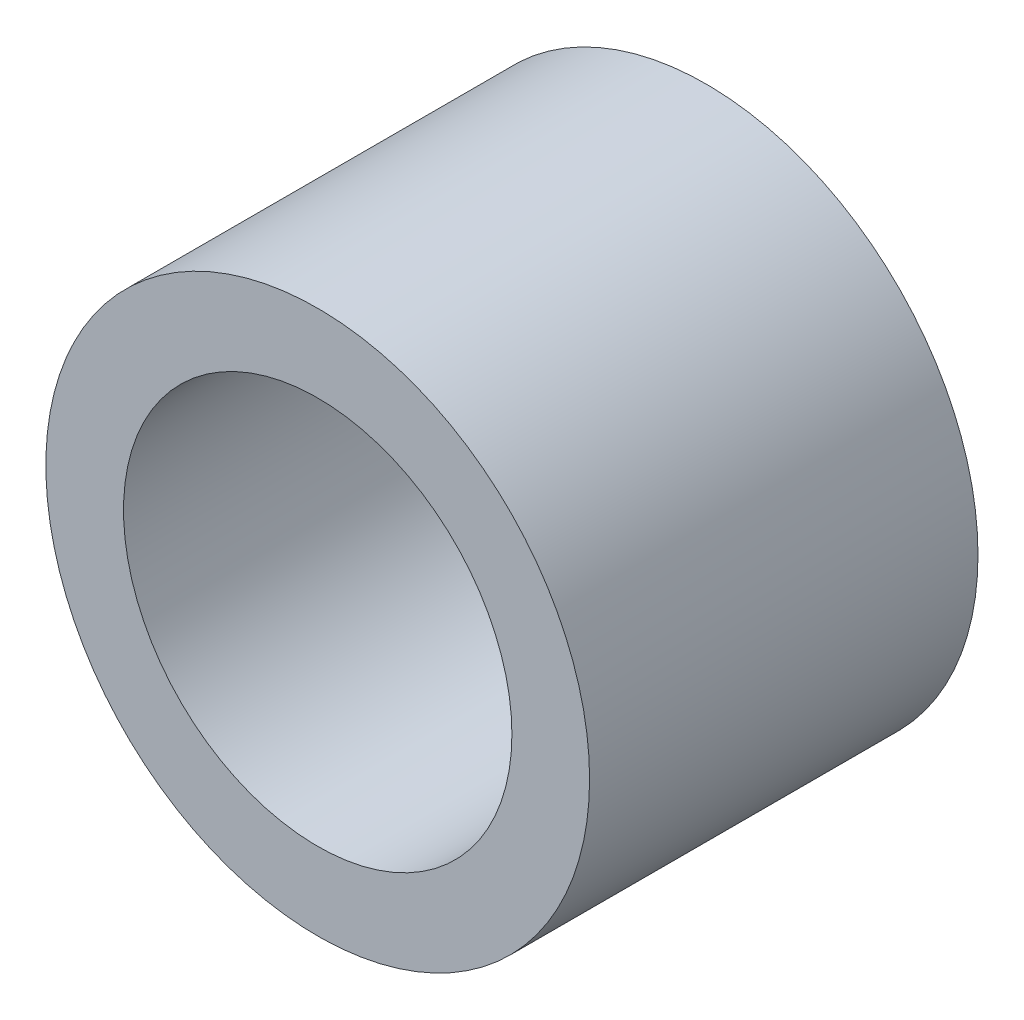
ISO-10303-21;
HEADER;
FILE_DESCRIPTION(('STEP AP214'),'2;1');
FILE_NAME('part.step','',(''),(''),'','','');
FILE_SCHEMA(('AUTOMOTIVE_DESIGN { 1 0 10303 214 1 1 1 1 }'));
ENDSEC;
DATA;
#1=APPLICATION_CONTEXT('core data for automotive mechanical design processes');
#2=APPLICATION_PROTOCOL_DEFINITION('international standard','automotive_design',2000,#1);
#3=PRODUCT_CONTEXT('',#1,'mechanical');
#4=PRODUCT('Part','Part','',(#3));
#5=PRODUCT_RELATED_PRODUCT_CATEGORY('part','',(#4));
#6=PRODUCT_DEFINITION_FORMATION('','',#4);
#7=PRODUCT_DEFINITION_CONTEXT('part definition',#1,'design');
#8=PRODUCT_DEFINITION('design','',#6,#7);
#9=PRODUCT_DEFINITION_SHAPE('','',#8);
#10=(LENGTH_UNIT() NAMED_UNIT(*) SI_UNIT(.MILLI.,.METRE.));
#11=(NAMED_UNIT(*) PLANE_ANGLE_UNIT() SI_UNIT($,.RADIAN.));
#12=(NAMED_UNIT(*) SI_UNIT($,.STERADIAN.) SOLID_ANGLE_UNIT());
#13=UNCERTAINTY_MEASURE_WITH_UNIT(LENGTH_MEASURE(1.E-05),#10,'distance_accuracy_value','');
#14=(GEOMETRIC_REPRESENTATION_CONTEXT(3) GLOBAL_UNCERTAINTY_ASSIGNED_CONTEXT((#13)) GLOBAL_UNIT_ASSIGNED_CONTEXT((#10,
#11,#12)) REPRESENTATION_CONTEXT('',''));
#15=CARTESIAN_POINT('',(0.,0.,0.));
#16=DIRECTION('',(0.,0.,1.));
#17=DIRECTION('',(1.,0.,0.));
#18=AXIS2_PLACEMENT_3D('',#15,#16,#17);
#19=CARTESIAN_POINT('',(0.,0.,2.5));
#20=DIRECTION('',(0.,0.,1.));
#21=DIRECTION('',(1.,0.,0.));
#22=AXIS2_PLACEMENT_3D('',#19,#20,#21);
#23=PLANE('',#22);
#24=CARTESIAN_POINT('',(0.,0.,2.5));
#25=DIRECTION('',(0.,0.,1.));
#26=DIRECTION('',(1.,0.,0.));
#27=AXIS2_PLACEMENT_3D('',#24,#25,#26);
#28=CIRCLE('',#27,3.5);
#29=CARTESIAN_POINT('',(3.5,0.,2.5));
#30=VERTEX_POINT('',#29);
#31=EDGE_CURVE('E10',#30,#30,#28,.T.);
#32=ORIENTED_EDGE('',*,*,#31,.T.);
#33=EDGE_LOOP('',(#32));
#34=FACE_BOUND('',#33,.T.);
#35=CARTESIAN_POINT('',(0.,0.,2.5));
#36=DIRECTION('',(0.,0.,1.));
#37=DIRECTION('',(1.,0.,0.));
#38=AXIS2_PLACEMENT_3D('',#35,#36,#37);
#39=CIRCLE('',#38,2.5);
#40=CARTESIAN_POINT('',(2.5,0.,2.5));
#41=VERTEX_POINT('',#40);
#42=EDGE_CURVE('E50',#41,#41,#39,.T.);
#43=ORIENTED_EDGE('',*,*,#42,.F.);
#44=EDGE_LOOP('',(#43));
#45=FACE_BOUND('',#44,.T.);
#46=ADVANCED_FACE('F39',(#34,#45),#23,.T.);
#47=CARTESIAN_POINT('',(0.,0.,-2.5));
#48=DIRECTION('',(0.,0.,1.));
#49=DIRECTION('',(1.,0.,0.));
#50=AXIS2_PLACEMENT_3D('',#47,#48,#49);
#51=PLANE('',#50);
#52=CARTESIAN_POINT('',(0.,0.,-2.5));
#53=DIRECTION('',(0.,0.,1.));
#54=DIRECTION('',(1.,0.,0.));
#55=AXIS2_PLACEMENT_3D('',#52,#53,#54);
#56=CIRCLE('',#55,3.5);
#57=CARTESIAN_POINT('',(3.5,0.,-2.5));
#58=VERTEX_POINT('',#57);
#59=EDGE_CURVE('E43',#58,#58,#56,.T.);
#60=ORIENTED_EDGE('',*,*,#59,.F.);
#61=EDGE_LOOP('',(#60));
#62=FACE_BOUND('',#61,.T.);
#63=CARTESIAN_POINT('',(0.,0.,-2.5));
#64=DIRECTION('',(0.,0.,1.));
#65=DIRECTION('',(1.,0.,0.));
#66=AXIS2_PLACEMENT_3D('',#63,#64,#65);
#67=CIRCLE('',#66,2.5);
#68=CARTESIAN_POINT('',(2.5,0.,-2.5));
#69=VERTEX_POINT('',#68);
#70=EDGE_CURVE('E52',#69,#69,#67,.T.);
#71=ORIENTED_EDGE('',*,*,#70,.T.);
#72=EDGE_LOOP('',(#71));
#73=FACE_BOUND('',#72,.T.);
#74=ADVANCED_FACE('F62',(#62,#73),#51,.F.);
#75=CARTESIAN_POINT('',(0.,0.,2.5));
#76=DIRECTION('',(0.,0.,-1.));
#77=DIRECTION('',(-1.,0.,0.));
#78=AXIS2_PLACEMENT_3D('',#75,#76,#77);
#79=CYLINDRICAL_SURFACE('',#78,3.5);
#80=ORIENTED_EDGE('',*,*,#31,.F.);
#81=EDGE_LOOP('',(#80));
#82=FACE_BOUND('',#81,.T.);
#83=ORIENTED_EDGE('',*,*,#59,.T.);
#84=EDGE_LOOP('',(#83));
#85=FACE_BOUND('',#84,.T.);
#86=ADVANCED_FACE('F41',(#82,#85),#79,.T.);
#87=CARTESIAN_POINT('',(0.,0.,2.5));
#88=DIRECTION('',(0.,0.,-1.));
#89=DIRECTION('',(-1.,0.,0.));
#90=AXIS2_PLACEMENT_3D('',#87,#88,#89);
#91=CYLINDRICAL_SURFACE('',#90,2.5);
#92=ORIENTED_EDGE('',*,*,#42,.T.);
#93=EDGE_LOOP('',(#92));
#94=FACE_BOUND('',#93,.T.);
#95=ORIENTED_EDGE('',*,*,#70,.F.);
#96=EDGE_LOOP('',(#95));
#97=FACE_BOUND('',#96,.T.);
#98=ADVANCED_FACE('F58',(#94,#97),#91,.F.);
#99=CLOSED_SHELL('',(#46,#74,#86,#98));
#100=MANIFOLD_SOLID_BREP('B2',#99);
#101=ADVANCED_BREP_SHAPE_REPRESENTATION('',(#18,#100),#14);
#102=SHAPE_DEFINITION_REPRESENTATION(#9,#101);
ENDSEC;
END-ISO-10303-21;
